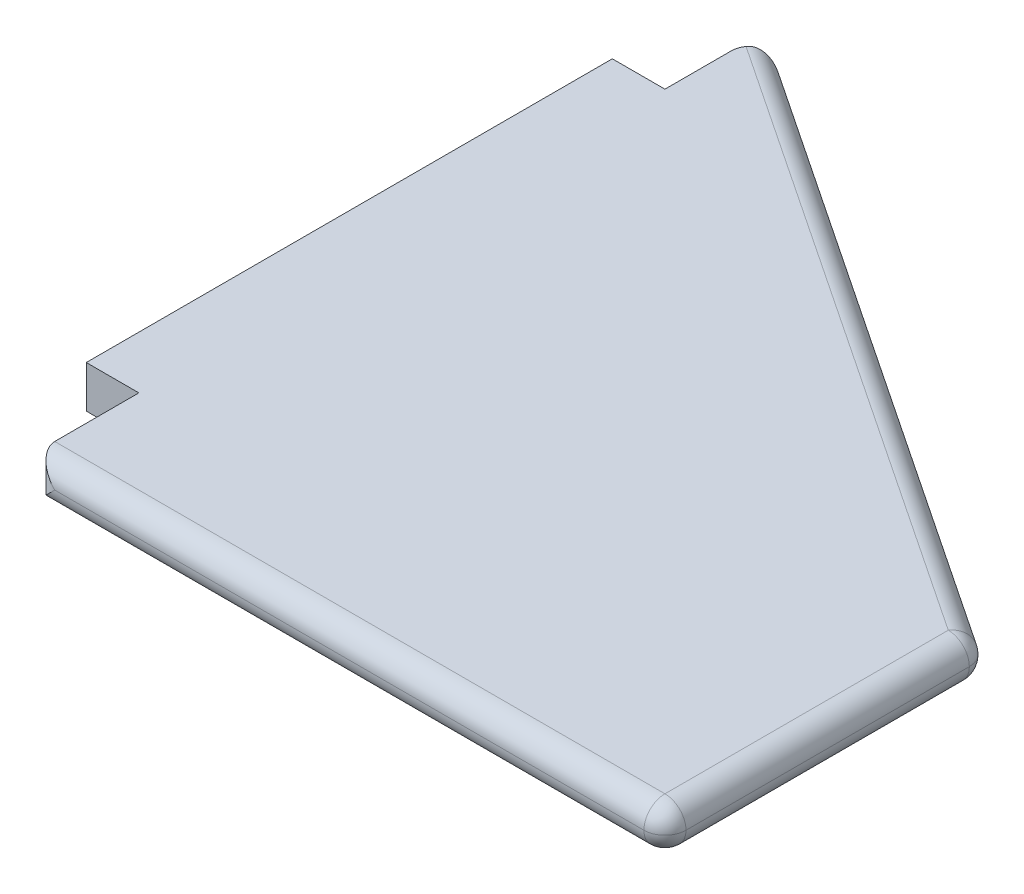
ISO-10303-21;
HEADER;
FILE_DESCRIPTION(('STEP AP214'),'2;1');
FILE_NAME('part.step','',(''),(''),'','','');
FILE_SCHEMA(('AUTOMOTIVE_DESIGN { 1 0 10303 214 1 1 1 1 }'));
ENDSEC;
DATA;
#1=APPLICATION_CONTEXT('core data for automotive mechanical design processes');
#2=APPLICATION_PROTOCOL_DEFINITION('international standard','automotive_design',2000,#1);
#3=PRODUCT_CONTEXT('',#1,'mechanical');
#4=PRODUCT('Part','Part','',(#3));
#5=PRODUCT_RELATED_PRODUCT_CATEGORY('part','',(#4));
#6=PRODUCT_DEFINITION_FORMATION('','',#4);
#7=PRODUCT_DEFINITION_CONTEXT('part definition',#1,'design');
#8=PRODUCT_DEFINITION('design','',#6,#7);
#9=PRODUCT_DEFINITION_SHAPE('','',#8);
#10=(LENGTH_UNIT() NAMED_UNIT(*) SI_UNIT(.MILLI.,.METRE.));
#11=(NAMED_UNIT(*) PLANE_ANGLE_UNIT() SI_UNIT($,.RADIAN.));
#12=(NAMED_UNIT(*) SI_UNIT($,.STERADIAN.) SOLID_ANGLE_UNIT());
#13=UNCERTAINTY_MEASURE_WITH_UNIT(LENGTH_MEASURE(1.E-05),#10,'distance_accuracy_value','');
#14=(GEOMETRIC_REPRESENTATION_CONTEXT(3) GLOBAL_UNCERTAINTY_ASSIGNED_CONTEXT((#13)) GLOBAL_UNIT_ASSIGNED_CONTEXT((#10,
#11,#12)) REPRESENTATION_CONTEXT('',''));
#15=CARTESIAN_POINT('',(0.,0.,0.));
#16=DIRECTION('',(0.,0.,1.));
#17=DIRECTION('',(1.,0.,0.));
#18=AXIS2_PLACEMENT_3D('',#15,#16,#17);
#19=CARTESIAN_POINT('',(3.175,2.54,0.));
#20=DIRECTION('',(0.,0.,-1.));
#21=DIRECTION('',(-1.,0.,0.));
#22=AXIS2_PLACEMENT_3D('',#19,#20,#21);
#23=PLANE('',#22);
#24=DIRECTION('',(1.,0.,0.));
#25=VECTOR('',#24,1.);
#26=CARTESIAN_POINT('',(3.175,0.,0.));
#27=LINE('',#26,#25);
#28=CARTESIAN_POINT('',(0.,0.,0.));
#29=VERTEX_POINT('',#28);
#30=CARTESIAN_POINT('',(3.175,0.,0.));
#31=VERTEX_POINT('',#30);
#32=EDGE_CURVE('E193',#29,#31,#27,.T.);
#33=ORIENTED_EDGE('',*,*,#32,.T.);
#34=DIRECTION('',(0.,-1.,0.));
#35=VECTOR('',#34,1.);
#36=CARTESIAN_POINT('',(3.175,2.54,0.));
#37=LINE('',#36,#35);
#38=CARTESIAN_POINT('',(3.175,2.54,0.));
#39=VERTEX_POINT('',#38);
#40=EDGE_CURVE('E210',#39,#31,#37,.T.);
#41=ORIENTED_EDGE('',*,*,#40,.F.);
#42=DIRECTION('',(1.,0.,0.));
#43=VECTOR('',#42,1.);
#44=CARTESIAN_POINT('',(3.175,2.54,0.));
#45=LINE('',#44,#43);
#46=CARTESIAN_POINT('',(0.,2.54,0.));
#47=VERTEX_POINT('',#46);
#48=EDGE_CURVE('E178',#47,#39,#45,.T.);
#49=ORIENTED_EDGE('',*,*,#48,.F.);
#50=DIRECTION('',(0.,-1.,0.));
#51=VECTOR('',#50,1.);
#52=CARTESIAN_POINT('',(0.,2.54,0.));
#53=LINE('',#52,#51);
#54=EDGE_CURVE('E192',#47,#29,#53,.T.);
#55=ORIENTED_EDGE('',*,*,#54,.T.);
#56=EDGE_LOOP('',(#33,#41,#49,#55));
#57=FACE_BOUND('',#56,.T.);
#58=ADVANCED_FACE('F33',(#57),#23,.F.);
#59=CARTESIAN_POINT('',(3.175,2.54,6.35));
#60=DIRECTION('',(1.,0.,0.));
#61=DIRECTION('',(0.,0.,-1.));
#62=AXIS2_PLACEMENT_3D('',#59,#60,#61);
#63=PLANE('',#62);
#64=DIRECTION('',(0.,0.,1.));
#65=VECTOR('',#64,1.);
#66=CARTESIAN_POINT('',(3.175,0.,6.35));
#67=LINE('',#66,#65);
#68=CARTESIAN_POINT('',(3.175,0.,5.08));
#69=VERTEX_POINT('',#68);
#70=EDGE_CURVE('E88',#31,#69,#67,.T.);
#71=ORIENTED_EDGE('',*,*,#70,.T.);
#72=DIRECTION('',(0.,-1.,0.));
#73=VECTOR('',#72,1.);
#74=CARTESIAN_POINT('',(3.175,2.54,5.08));
#75=LINE('',#74,#73);
#76=CARTESIAN_POINT('',(3.175,2.54,5.08));
#77=VERTEX_POINT('',#76);
#78=EDGE_CURVE('E11',#69,#77,#75,.F.);
#79=ORIENTED_EDGE('',*,*,#78,.T.);
#80=DIRECTION('',(0.,0.,1.));
#81=VECTOR('',#80,1.);
#82=CARTESIAN_POINT('',(3.175,2.54,6.35));
#83=LINE('',#82,#81);
#84=EDGE_CURVE('E171',#39,#77,#83,.T.);
#85=ORIENTED_EDGE('',*,*,#84,.F.);
#86=ORIENTED_EDGE('',*,*,#40,.T.);
#87=EDGE_LOOP('',(#71,#79,#85,#86));
#88=FACE_BOUND('',#87,.T.);
#89=ADVANCED_FACE('F170',(#88),#63,.F.);
#90=CARTESIAN_POINT('',(3.175,2.54,-31.75));
#91=DIRECTION('',(1.,0.,0.));
#92=DIRECTION('',(0.,0.,-1.));
#93=AXIS2_PLACEMENT_3D('',#90,#91,#92);
#94=PLANE('',#93);
#95=DIRECTION('',(0.,0.,1.));
#96=VECTOR('',#95,1.);
#97=CARTESIAN_POINT('',(3.175,2.54,-31.75));
#98=LINE('',#97,#96);
#99=CARTESIAN_POINT('',(3.175,2.54,-35.7269832933869));
#100=VERTEX_POINT('',#99);
#101=CARTESIAN_POINT('',(3.175,2.54,-31.75));
#102=VERTEX_POINT('',#101);
#103=EDGE_CURVE('E180',#100,#102,#98,.T.);
#104=ORIENTED_EDGE('',*,*,#103,.F.);
#105=DIRECTION('',(0.,-1.,0.));
#106=VECTOR('',#105,1.);
#107=CARTESIAN_POINT('',(3.175,2.54,-35.7269832933869));
#108=LINE('',#107,#106);
#109=CARTESIAN_POINT('',(3.175,0.,-35.7269832933869));
#110=VERTEX_POINT('',#109);
#111=EDGE_CURVE('E131',#100,#110,#108,.T.);
#112=ORIENTED_EDGE('',*,*,#111,.T.);
#113=DIRECTION('',(0.,0.,1.));
#114=VECTOR('',#113,1.);
#115=CARTESIAN_POINT('',(3.175,0.,-31.75));
#116=LINE('',#115,#114);
#117=CARTESIAN_POINT('',(3.175,0.,-31.75));
#118=VERTEX_POINT('',#117);
#119=EDGE_CURVE('E197',#110,#118,#116,.T.);
#120=ORIENTED_EDGE('',*,*,#119,.T.);
#121=DIRECTION('',(0.,-1.,0.));
#122=VECTOR('',#121,1.);
#123=CARTESIAN_POINT('',(3.175,2.54,-31.75));
#124=LINE('',#123,#122);
#125=EDGE_CURVE('E207',#102,#118,#124,.T.);
#126=ORIENTED_EDGE('',*,*,#125,.F.);
#127=EDGE_LOOP('',(#104,#112,#120,#126));
#128=FACE_BOUND('',#127,.T.);
#129=ADVANCED_FACE('F266',(#128),#94,.F.);
#130=CARTESIAN_POINT('',(0.,2.54,-31.75));
#131=DIRECTION('',(0.,0.,1.));
#132=DIRECTION('',(1.,0.,0.));
#133=AXIS2_PLACEMENT_3D('',#130,#131,#132);
#134=PLANE('',#133);
#135=DIRECTION('',(-1.,0.,0.));
#136=VECTOR('',#135,1.);
#137=CARTESIAN_POINT('',(0.,0.,-31.75));
#138=LINE('',#137,#136);
#139=CARTESIAN_POINT('',(0.,0.,-31.75));
#140=VERTEX_POINT('',#139);
#141=EDGE_CURVE('E199',#118,#140,#138,.T.);
#142=ORIENTED_EDGE('',*,*,#141,.T.);
#143=DIRECTION('',(0.,-1.,0.));
#144=VECTOR('',#143,1.);
#145=CARTESIAN_POINT('',(0.,2.54,-31.75));
#146=LINE('',#145,#144);
#147=CARTESIAN_POINT('',(0.,2.54,-31.75));
#148=VERTEX_POINT('',#147);
#149=EDGE_CURVE('E204',#148,#140,#146,.T.);
#150=ORIENTED_EDGE('',*,*,#149,.F.);
#151=DIRECTION('',(-1.,0.,0.));
#152=VECTOR('',#151,1.);
#153=CARTESIAN_POINT('',(0.,2.54,-31.75));
#154=LINE('',#153,#152);
#155=EDGE_CURVE('E183',#102,#148,#154,.T.);
#156=ORIENTED_EDGE('',*,*,#155,.F.);
#157=ORIENTED_EDGE('',*,*,#125,.T.);
#158=EDGE_LOOP('',(#142,#150,#156,#157));
#159=FACE_BOUND('',#158,.T.);
#160=ADVANCED_FACE('F287',(#159),#134,.F.);
#161=CARTESIAN_POINT('',(0.,2.54,0.));
#162=DIRECTION('',(1.,0.,0.));
#163=DIRECTION('',(0.,0.,-1.));
#164=AXIS2_PLACEMENT_3D('',#161,#162,#163);
#165=PLANE('',#164);
#166=DIRECTION('',(0.,0.,1.));
#167=VECTOR('',#166,1.);
#168=CARTESIAN_POINT('',(0.,0.,0.));
#169=LINE('',#168,#167);
#170=EDGE_CURVE('E185',#140,#29,#169,.T.);
#171=ORIENTED_EDGE('',*,*,#170,.T.);
#172=ORIENTED_EDGE('',*,*,#54,.F.);
#173=DIRECTION('',(0.,0.,1.));
#174=VECTOR('',#173,1.);
#175=CARTESIAN_POINT('',(0.,2.54,0.));
#176=LINE('',#175,#174);
#177=EDGE_CURVE('E190',#148,#47,#176,.T.);
#178=ORIENTED_EDGE('',*,*,#177,.F.);
#179=ORIENTED_EDGE('',*,*,#149,.T.);
#180=EDGE_LOOP('',(#171,#172,#178,#179));
#181=FACE_BOUND('',#180,.T.);
#182=ADVANCED_FACE('F290',(#181),#165,.F.);
#183=CARTESIAN_POINT('',(0.,2.54,0.));
#184=DIRECTION('',(0.,-1.,0.));
#185=DIRECTION('',(0.,0.,-1.));
#186=AXIS2_PLACEMENT_3D('',#183,#184,#185);
#187=PLANE('',#186);
#188=DIRECTION('',(-0.832050294337844,0.,-0.554700196225229));
#189=VECTOR('',#188,1.);
#190=CARTESIAN_POINT('',(17.8570692123324,2.54,-26.7856038184986));
#191=LINE('',#190,#189);
#192=CARTESIAN_POINT('',(40.005,2.54,-12.0203166267202));
#193=VERTEX_POINT('',#192);
#194=CARTESIAN_POINT('',(3.38829612619094,2.54,-36.431452542593));
#195=VERTEX_POINT('',#194);
#196=EDGE_CURVE('E215',#193,#195,#191,.T.);
#197=ORIENTED_EDGE('',*,*,#196,.T.);
#198=CARTESIAN_POINT('',(4.445,2.54,-35.7269832933869));
#199=DIRECTION('',(0.,-1.,0.));
#200=DIRECTION('',(0.,0.,-1.));
#201=AXIS2_PLACEMENT_3D('',#198,#199,#200);
#202=CIRCLE('',#201,1.27);
#203=EDGE_CURVE('E217',#195,#100,#202,.F.);
#204=ORIENTED_EDGE('',*,*,#203,.T.);
#205=ORIENTED_EDGE('',*,*,#103,.T.);
#206=ORIENTED_EDGE('',*,*,#155,.T.);
#207=ORIENTED_EDGE('',*,*,#177,.T.);
#208=ORIENTED_EDGE('',*,*,#48,.T.);
#209=ORIENTED_EDGE('',*,*,#84,.T.);
#210=DIRECTION('',(1.,0.,0.));
#211=VECTOR('',#210,1.);
#212=CARTESIAN_POINT('',(0.,2.54,5.08));
#213=LINE('',#212,#211);
#214=CARTESIAN_POINT('',(40.005,2.54,5.08));
#215=VERTEX_POINT('',#214);
#216=EDGE_CURVE('E165',#77,#215,#213,.T.);
#217=ORIENTED_EDGE('',*,*,#216,.T.);
#218=DIRECTION('',(0.,0.,-1.));
#219=VECTOR('',#218,1.);
#220=CARTESIAN_POINT('',(40.005,2.54,0.));
#221=LINE('',#220,#219);
#222=EDGE_CURVE('E213',#215,#193,#221,.T.);
#223=ORIENTED_EDGE('',*,*,#222,.T.);
#224=EDGE_LOOP('',(#197,#204,#205,#206,#207,#208,#209,#217,#223));
#225=FACE_BOUND('',#224,.T.);
#226=ADVANCED_FACE('F175',(#225),#187,.F.);
#227=CARTESIAN_POINT('',(0.,0.,0.));
#228=DIRECTION('',(0.,-1.,0.));
#229=DIRECTION('',(0.,0.,-1.));
#230=AXIS2_PLACEMENT_3D('',#227,#228,#229);
#231=PLANE('',#230);
#232=ORIENTED_EDGE('',*,*,#119,.F.);
#233=CARTESIAN_POINT('',(4.445,0.,-35.7269832933869));
#234=DIRECTION('',(0.,-1.,0.));
#235=DIRECTION('',(0.,0.,-1.));
#236=AXIS2_PLACEMENT_3D('',#233,#234,#235);
#237=CIRCLE('',#236,1.27);
#238=CARTESIAN_POINT('',(3.38829612619094,0.,-36.4314525425929));
#239=VERTEX_POINT('',#238);
#240=EDGE_CURVE('E43',#110,#239,#237,.T.);
#241=ORIENTED_EDGE('',*,*,#240,.T.);
#242=DIRECTION('',(-0.832050294337844,0.,-0.554700196225229));
#243=VECTOR('',#242,1.);
#244=CARTESIAN_POINT('',(40.570530750794,0.,-11.6432961261909));
#245=LINE('',#244,#243);
#246=CARTESIAN_POINT('',(40.005,0.,-12.0203166267203));
#247=VERTEX_POINT('',#246);
#248=EDGE_CURVE('E126',#239,#247,#245,.F.);
#249=ORIENTED_EDGE('',*,*,#248,.T.);
#250=DIRECTION('',(0.,0.,-1.));
#251=VECTOR('',#250,1.);
#252=CARTESIAN_POINT('',(40.005,0.,6.35));
#253=LINE('',#252,#251);
#254=CARTESIAN_POINT('',(40.005,0.,5.08));
#255=VERTEX_POINT('',#254);
#256=EDGE_CURVE('E123',#247,#255,#253,.F.);
#257=ORIENTED_EDGE('',*,*,#256,.T.);
#258=DIRECTION('',(1.,0.,0.));
#259=VECTOR('',#258,1.);
#260=CARTESIAN_POINT('',(3.175,0.,5.08));
#261=LINE('',#260,#259);
#262=EDGE_CURVE('E125',#255,#69,#261,.F.);
#263=ORIENTED_EDGE('',*,*,#262,.T.);
#264=ORIENTED_EDGE('',*,*,#70,.F.);
#265=ORIENTED_EDGE('',*,*,#32,.F.);
#266=ORIENTED_EDGE('',*,*,#170,.F.);
#267=ORIENTED_EDGE('',*,*,#141,.F.);
#268=EDGE_LOOP('',(#232,#241,#249,#257,#263,#264,#265,#266,#267));
#269=FACE_BOUND('',#268,.T.);
#270=ADVANCED_FACE('F124',(#269),#231,.T.);
#271=CARTESIAN_POINT('',(3.175,1.27,5.08));
#272=DIRECTION('',(-1.,0.,0.));
#273=DIRECTION('',(0.,0.,1.));
#274=AXIS2_PLACEMENT_3D('',#271,#272,#273);
#275=CYLINDRICAL_SURFACE('',#274,1.27);
#276=CARTESIAN_POINT('',(4.445,1.27,5.08));
#277=DIRECTION('',(-0.707106781186547,0.707106781186547,0.));
#278=DIRECTION('',(-0.707106781186547,-0.707106781186547,0.));
#279=AXIS2_PLACEMENT_3D('',#276,#277,#278);
#280=ELLIPSE('',#279,1.79605122421383,1.27);
#281=CARTESIAN_POINT('',(4.445,1.27,6.35));
#282=VERTEX_POINT('',#281);
#283=EDGE_CURVE('E37',#69,#282,#280,.T.);
#284=ORIENTED_EDGE('',*,*,#283,.F.);
#285=ORIENTED_EDGE('',*,*,#262,.F.);
#286=CARTESIAN_POINT('',(40.005,1.27,5.08));
#287=DIRECTION('',(1.,0.,0.));
#288=DIRECTION('',(0.,0.,-1.));
#289=AXIS2_PLACEMENT_3D('',#286,#287,#288);
#290=CIRCLE('',#289,1.27);
#291=CARTESIAN_POINT('',(40.005,1.27,6.35));
#292=VERTEX_POINT('',#291);
#293=EDGE_CURVE('E74',#292,#255,#290,.T.);
#294=ORIENTED_EDGE('',*,*,#293,.F.);
#295=DIRECTION('',(1.,0.,0.));
#296=VECTOR('',#295,1.);
#297=CARTESIAN_POINT('',(41.275,1.27,6.35));
#298=LINE('',#297,#296);
#299=EDGE_CURVE('E148',#282,#292,#298,.T.);
#300=ORIENTED_EDGE('',*,*,#299,.F.);
#301=EDGE_LOOP('',(#284,#285,#294,#300));
#302=FACE_BOUND('',#301,.T.);
#303=ADVANCED_FACE('F35',(#302),#275,.T.);
#304=CARTESIAN_POINT('',(4.445,2.54,5.08));
#305=DIRECTION('',(0.,-1.,0.));
#306=DIRECTION('',(0.,0.,-1.));
#307=AXIS2_PLACEMENT_3D('',#304,#305,#306);
#308=CYLINDRICAL_SURFACE('',#307,1.27);
#309=ORIENTED_EDGE('',*,*,#78,.F.);
#310=ORIENTED_EDGE('',*,*,#283,.T.);
#311=CARTESIAN_POINT('',(4.445,1.27,5.08));
#312=DIRECTION('',(0.707106781186547,0.707106781186547,0.));
#313=DIRECTION('',(0.707106781186547,-0.707106781186547,0.));
#314=AXIS2_PLACEMENT_3D('',#311,#312,#313);
#315=ELLIPSE('',#314,1.79605122421383,1.27);
#316=EDGE_CURVE('E144',#77,#282,#315,.T.);
#317=ORIENTED_EDGE('',*,*,#316,.F.);
#318=EDGE_LOOP('',(#309,#310,#317));
#319=FACE_BOUND('',#318,.T.);
#320=ADVANCED_FACE('F166',(#319),#308,.T.);
#321=CARTESIAN_POINT('',(40.005,1.27,5.08));
#322=DIRECTION('',(0.,0.,1.));
#323=DIRECTION('',(1.,0.,0.));
#324=AXIS2_PLACEMENT_3D('',#321,#322,#323);
#325=SPHERICAL_SURFACE('',#324,1.27);
#326=CARTESIAN_POINT('',(40.005,1.27,5.08));
#327=DIRECTION('',(0.,-1.,0.));
#328=DIRECTION('',(0.,0.,-1.));
#329=AXIS2_PLACEMENT_3D('',#326,#327,#328);
#330=CIRCLE('',#329,1.27);
#331=CARTESIAN_POINT('',(41.275,1.27,5.08));
#332=VERTEX_POINT('',#331);
#333=EDGE_CURVE('E137',#292,#332,#330,.F.);
#334=ORIENTED_EDGE('',*,*,#333,.F.);
#335=ORIENTED_EDGE('',*,*,#293,.T.);
#336=CARTESIAN_POINT('',(40.005,1.27,5.08));
#337=DIRECTION('',(0.,0.,1.));
#338=DIRECTION('',(1.,0.,0.));
#339=AXIS2_PLACEMENT_3D('',#336,#337,#338);
#340=CIRCLE('',#339,1.27);
#341=EDGE_CURVE('E135',#332,#255,#340,.F.);
#342=ORIENTED_EDGE('',*,*,#341,.F.);
#343=EDGE_LOOP('',(#334,#335,#342));
#344=FACE_BOUND('',#343,.T.);
#345=ADVANCED_FACE('F134',(#344),#325,.T.);
#346=CARTESIAN_POINT('',(0.,1.27,5.08));
#347=DIRECTION('',(1.,0.,0.));
#348=DIRECTION('',(0.,0.,-1.));
#349=AXIS2_PLACEMENT_3D('',#346,#347,#348);
#350=CYLINDRICAL_SURFACE('',#349,1.27);
#351=ORIENTED_EDGE('',*,*,#316,.T.);
#352=ORIENTED_EDGE('',*,*,#299,.T.);
#353=CARTESIAN_POINT('',(40.005,1.27,5.08));
#354=DIRECTION('',(1.,0.,0.));
#355=DIRECTION('',(0.,0.,-1.));
#356=AXIS2_PLACEMENT_3D('',#353,#354,#355);
#357=CIRCLE('',#356,1.27);
#358=EDGE_CURVE('E145',#215,#292,#357,.T.);
#359=ORIENTED_EDGE('',*,*,#358,.F.);
#360=ORIENTED_EDGE('',*,*,#216,.F.);
#361=EDGE_LOOP('',(#351,#352,#359,#360));
#362=FACE_BOUND('',#361,.T.);
#363=ADVANCED_FACE('F164',(#362),#350,.T.);
#364=CARTESIAN_POINT('',(40.005,1.27,-12.7));
#365=DIRECTION('',(0.,0.,1.));
#366=DIRECTION('',(1.,0.,0.));
#367=AXIS2_PLACEMENT_3D('',#364,#365,#366);
#368=CYLINDRICAL_SURFACE('',#367,1.27);
#369=ORIENTED_EDGE('',*,*,#341,.T.);
#370=ORIENTED_EDGE('',*,*,#256,.F.);
#371=CARTESIAN_POINT('',(40.005,1.27,-12.0203166267203));
#372=DIRECTION('',(0.,0.,-1.));
#373=DIRECTION('',(0.,1.,0.));
#374=AXIS2_PLACEMENT_3D('',#371,#372,#373);
#375=CIRCLE('',#374,1.27);
#376=CARTESIAN_POINT('',(41.275,1.27,-12.0203166267203));
#377=VERTEX_POINT('',#376);
#378=EDGE_CURVE('E151',#377,#247,#375,.T.);
#379=ORIENTED_EDGE('',*,*,#378,.F.);
#380=DIRECTION('',(0.,0.,-1.));
#381=VECTOR('',#380,1.);
#382=CARTESIAN_POINT('',(41.275,1.27,-12.7));
#383=LINE('',#382,#381);
#384=EDGE_CURVE('E142',#332,#377,#383,.T.);
#385=ORIENTED_EDGE('',*,*,#384,.F.);
#386=EDGE_LOOP('',(#369,#370,#379,#385));
#387=FACE_BOUND('',#386,.T.);
#388=ADVANCED_FACE('F140',(#387),#368,.T.);
#389=CARTESIAN_POINT('',(40.005,1.27,5.08));
#390=DIRECTION('',(0.,0.,1.));
#391=DIRECTION('',(1.,0.,0.));
#392=AXIS2_PLACEMENT_3D('',#389,#390,#391);
#393=SPHERICAL_SURFACE('',#392,1.27);
#394=ORIENTED_EDGE('',*,*,#358,.T.);
#395=ORIENTED_EDGE('',*,*,#333,.T.);
#396=CARTESIAN_POINT('',(40.005,1.27,5.08));
#397=DIRECTION('',(0.,0.,1.));
#398=DIRECTION('',(1.,0.,0.));
#399=AXIS2_PLACEMENT_3D('',#396,#397,#398);
#400=CIRCLE('',#399,1.27);
#401=EDGE_CURVE('E159',#215,#332,#400,.F.);
#402=ORIENTED_EDGE('',*,*,#401,.F.);
#403=EDGE_LOOP('',(#394,#395,#402));
#404=FACE_BOUND('',#403,.T.);
#405=ADVANCED_FACE('F158',(#404),#393,.T.);
#406=CARTESIAN_POINT('',(40.005,1.27,-12.0203166267203));
#407=DIRECTION('',(0.,-1.,0.));
#408=DIRECTION('',(0.,0.,-1.));
#409=AXIS2_PLACEMENT_3D('',#406,#407,#408);
#410=SPHERICAL_SURFACE('',#409,1.27);
#411=CARTESIAN_POINT('',(40.005,1.27,-12.0203166267202));
#412=DIRECTION('',(0.,-1.,0.));
#413=DIRECTION('',(0.,0.,-1.));
#414=AXIS2_PLACEMENT_3D('',#411,#412,#413);
#415=CIRCLE('',#414,1.27);
#416=CARTESIAN_POINT('',(40.709469249206,1.27,-13.0770205005293));
#417=VERTEX_POINT('',#416);
#418=EDGE_CURVE('E241',#377,#417,#415,.F.);
#419=ORIENTED_EDGE('',*,*,#418,.F.);
#420=ORIENTED_EDGE('',*,*,#378,.T.);
#421=CARTESIAN_POINT('',(40.005,1.27,-12.0203166267203));
#422=DIRECTION('',(0.832050294337845,0.,0.554700196225228));
#423=DIRECTION('',(0.554700196225228,0.,-0.832050294337845));
#424=AXIS2_PLACEMENT_3D('',#421,#422,#423);
#425=CIRCLE('',#424,1.27);
#426=EDGE_CURVE('E236',#417,#247,#425,.F.);
#427=ORIENTED_EDGE('',*,*,#426,.F.);
#428=EDGE_LOOP('',(#419,#420,#427));
#429=FACE_BOUND('',#428,.T.);
#430=ADVANCED_FACE('F245',(#429),#410,.T.);
#431=CARTESIAN_POINT('',(40.005,1.27,0.));
#432=DIRECTION('',(0.,0.,-1.));
#433=DIRECTION('',(-1.,0.,0.));
#434=AXIS2_PLACEMENT_3D('',#431,#432,#433);
#435=CYLINDRICAL_SURFACE('',#434,1.27);
#436=ORIENTED_EDGE('',*,*,#401,.T.);
#437=ORIENTED_EDGE('',*,*,#384,.T.);
#438=CARTESIAN_POINT('',(40.005,1.27,-12.0203166267202));
#439=DIRECTION('',(0.,0.,-1.));
#440=DIRECTION('',(-1.,0.,0.));
#441=AXIS2_PLACEMENT_3D('',#438,#439,#440);
#442=CIRCLE('',#441,1.27);
#443=EDGE_CURVE('E233',#193,#377,#442,.T.);
#444=ORIENTED_EDGE('',*,*,#443,.F.);
#445=ORIENTED_EDGE('',*,*,#222,.F.);
#446=EDGE_LOOP('',(#436,#437,#444,#445));
#447=FACE_BOUND('',#446,.T.);
#448=ADVANCED_FACE('F258',(#447),#435,.T.);
#449=CARTESIAN_POINT('',(2.47053075079396,1.27,-37.0432961261909));
#450=DIRECTION('',(0.832050294337844,0.,0.554700196225229));
#451=DIRECTION('',(0.554700196225229,0.,-0.832050294337844));
#452=AXIS2_PLACEMENT_3D('',#449,#450,#451);
#453=CYLINDRICAL_SURFACE('',#452,1.27);
#454=ORIENTED_EDGE('',*,*,#426,.T.);
#455=ORIENTED_EDGE('',*,*,#248,.F.);
#456=CARTESIAN_POINT('',(4.445,1.27,-35.7269832933869));
#457=DIRECTION('',(0.588348405414552,-0.707106781186547,0.392232270276368));
#458=DIRECTION('',(0.588348405414552,0.707106781186547,0.392232270276368));
#459=AXIS2_PLACEMENT_3D('',#456,#457,#458);
#460=ELLIPSE('',#459,1.79605122421383,1.27);
#461=CARTESIAN_POINT('',(5.14946924920604,1.27,-36.783687167196));
#462=VERTEX_POINT('',#461);
#463=EDGE_CURVE('E230',#462,#239,#460,.F.);
#464=ORIENTED_EDGE('',*,*,#463,.F.);
#465=DIRECTION('',(-0.832050294337844,0.,-0.554700196225229));
#466=VECTOR('',#465,1.);
#467=CARTESIAN_POINT('',(3.175,1.27,-38.1));
#468=LINE('',#467,#466);
#469=EDGE_CURVE('E227',#417,#462,#468,.T.);
#470=ORIENTED_EDGE('',*,*,#469,.F.);
#471=EDGE_LOOP('',(#454,#455,#464,#470));
#472=FACE_BOUND('',#471,.T.);
#473=ADVANCED_FACE('F248',(#472),#453,.T.);
#474=CARTESIAN_POINT('',(40.005,1.27,-12.0203166267202));
#475=DIRECTION('',(0.,1.,0.));
#476=DIRECTION('',(0.,0.,1.));
#477=AXIS2_PLACEMENT_3D('',#474,#475,#476);
#478=SPHERICAL_SURFACE('',#477,1.27);
#479=ORIENTED_EDGE('',*,*,#443,.T.);
#480=ORIENTED_EDGE('',*,*,#418,.T.);
#481=CARTESIAN_POINT('',(40.005,1.27,-12.0203166267202));
#482=DIRECTION('',(0.832050294337843,0.,0.55470019622523));
#483=DIRECTION('',(0.55470019622523,0.,-0.832050294337843));
#484=AXIS2_PLACEMENT_3D('',#481,#482,#483);
#485=CIRCLE('',#484,1.27);
#486=EDGE_CURVE('E224',#193,#417,#485,.F.);
#487=ORIENTED_EDGE('',*,*,#486,.F.);
#488=EDGE_LOOP('',(#479,#480,#487));
#489=FACE_BOUND('',#488,.T.);
#490=ADVANCED_FACE('F255',(#489),#478,.T.);
#491=CARTESIAN_POINT('',(4.445,2.54,-35.7269832933869));
#492=DIRECTION('',(0.,-1.,0.));
#493=DIRECTION('',(0.,0.,-1.));
#494=AXIS2_PLACEMENT_3D('',#491,#492,#493);
#495=CYLINDRICAL_SURFACE('',#494,1.27);
#496=ORIENTED_EDGE('',*,*,#111,.F.);
#497=ORIENTED_EDGE('',*,*,#203,.F.);
#498=CARTESIAN_POINT('',(4.445,1.27,-35.7269832933869));
#499=DIRECTION('',(-0.588348405414552,-0.707106781186547,-0.392232270276368));
#500=DIRECTION('',(0.588348405414552,-0.707106781186547,0.392232270276368));
#501=AXIS2_PLACEMENT_3D('',#498,#499,#500);
#502=ELLIPSE('',#501,1.79605122421383,1.27);
#503=EDGE_CURVE('E222',#462,#195,#502,.F.);
#504=ORIENTED_EDGE('',*,*,#503,.F.);
#505=ORIENTED_EDGE('',*,*,#463,.T.);
#506=ORIENTED_EDGE('',*,*,#240,.F.);
#507=EDGE_LOOP('',(#496,#497,#504,#505,#506));
#508=FACE_BOUND('',#507,.T.);
#509=ADVANCED_FACE('F268',(#508),#495,.T.);
#510=CARTESIAN_POINT('',(17.8570692123324,1.27,-26.7856038184986));
#511=DIRECTION('',(-0.832050294337844,0.,-0.554700196225229));
#512=DIRECTION('',(-0.554700196225229,0.,0.832050294337844));
#513=AXIS2_PLACEMENT_3D('',#510,#511,#512);
#514=CYLINDRICAL_SURFACE('',#513,1.27);
#515=ORIENTED_EDGE('',*,*,#486,.T.);
#516=ORIENTED_EDGE('',*,*,#469,.T.);
#517=ORIENTED_EDGE('',*,*,#503,.T.);
#518=ORIENTED_EDGE('',*,*,#196,.F.);
#519=EDGE_LOOP('',(#515,#516,#517,#518));
#520=FACE_BOUND('',#519,.T.);
#521=ADVANCED_FACE('F253',(#520),#514,.T.);
#522=CLOSED_SHELL('',(#58,#89,#129,#160,#182,#226,#270,#303,#320,#345,#363,#388,#405,#430,#448,
#473,#490,#509,#521));
#523=MANIFOLD_SOLID_BREP('B2',#522);
#524=ADVANCED_BREP_SHAPE_REPRESENTATION('',(#18,#523),#14);
#525=SHAPE_DEFINITION_REPRESENTATION(#9,#524);
ENDSEC;
END-ISO-10303-21;
